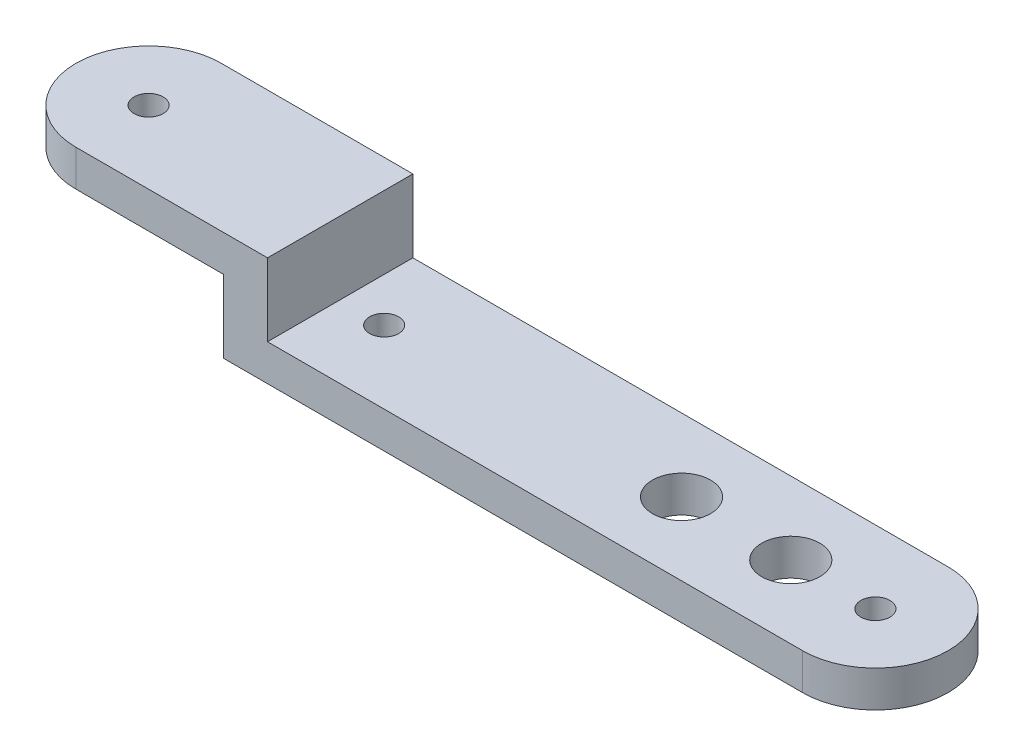
ISO-10303-21;
HEADER;
FILE_DESCRIPTION(('STEP AP214'),'2;1');
FILE_NAME('part.step','',(''),(''),'','','');
FILE_SCHEMA(('AUTOMOTIVE_DESIGN { 1 0 10303 214 1 1 1 1 }'));
ENDSEC;
DATA;
#1=APPLICATION_CONTEXT('core data for automotive mechanical design processes');
#2=APPLICATION_PROTOCOL_DEFINITION('international standard','automotive_design',2000,#1);
#3=PRODUCT_CONTEXT('',#1,'mechanical');
#4=PRODUCT('Part','Part','',(#3));
#5=PRODUCT_RELATED_PRODUCT_CATEGORY('part','',(#4));
#6=PRODUCT_DEFINITION_FORMATION('','',#4);
#7=PRODUCT_DEFINITION_CONTEXT('part definition',#1,'design');
#8=PRODUCT_DEFINITION('design','',#6,#7);
#9=PRODUCT_DEFINITION_SHAPE('','',#8);
#10=(LENGTH_UNIT() NAMED_UNIT(*) SI_UNIT(.MILLI.,.METRE.));
#11=(NAMED_UNIT(*) PLANE_ANGLE_UNIT() SI_UNIT($,.RADIAN.));
#12=(NAMED_UNIT(*) SI_UNIT($,.STERADIAN.) SOLID_ANGLE_UNIT());
#13=UNCERTAINTY_MEASURE_WITH_UNIT(LENGTH_MEASURE(1.E-05),#10,'distance_accuracy_value','');
#14=(GEOMETRIC_REPRESENTATION_CONTEXT(3) GLOBAL_UNCERTAINTY_ASSIGNED_CONTEXT((#13)) GLOBAL_UNIT_ASSIGNED_CONTEXT((#10,
#11,#12)) REPRESENTATION_CONTEXT('',''));
#15=CARTESIAN_POINT('',(0.,0.,0.));
#16=DIRECTION('',(0.,0.,1.));
#17=DIRECTION('',(1.,0.,0.));
#18=AXIS2_PLACEMENT_3D('',#15,#16,#17);
#19=CARTESIAN_POINT('',(0.,15.,0.));
#20=DIRECTION('',(0.,-1.,0.));
#21=DIRECTION('',(0.,0.,-1.));
#22=AXIS2_PLACEMENT_3D('',#19,#20,#21);
#23=CYLINDRICAL_SURFACE('',#22,10.);
#24=CARTESIAN_POINT('',(0.,10.,0.));
#25=DIRECTION('',(0.,-1.,0.));
#26=DIRECTION('',(0.,0.,-1.));
#27=AXIS2_PLACEMENT_3D('',#24,#25,#26);
#28=CIRCLE('',#27,10.);
#29=CARTESIAN_POINT('',(0.,10.,10.));
#30=VERTEX_POINT('',#29);
#31=CARTESIAN_POINT('',(0.,10.,-10.));
#32=VERTEX_POINT('',#31);
#33=EDGE_CURVE('E58',#30,#32,#28,.T.);
#34=ORIENTED_EDGE('',*,*,#33,.F.);
#35=DIRECTION('',(0.,-1.,0.));
#36=VECTOR('',#35,1.);
#37=CARTESIAN_POINT('',(0.,15.,10.));
#38=LINE('',#37,#36);
#39=CARTESIAN_POINT('',(0.,15.,10.));
#40=VERTEX_POINT('',#39);
#41=EDGE_CURVE('E152',#40,#30,#38,.T.);
#42=ORIENTED_EDGE('',*,*,#41,.F.);
#43=CARTESIAN_POINT('',(0.,15.,0.));
#44=DIRECTION('',(0.,1.,0.));
#45=DIRECTION('',(0.,0.,1.));
#46=AXIS2_PLACEMENT_3D('',#43,#44,#45);
#47=CIRCLE('',#46,10.);
#48=CARTESIAN_POINT('',(0.,15.,-10.));
#49=VERTEX_POINT('',#48);
#50=EDGE_CURVE('E130',#49,#40,#47,.T.);
#51=ORIENTED_EDGE('',*,*,#50,.F.);
#52=DIRECTION('',(0.,-1.,0.));
#53=VECTOR('',#52,1.);
#54=CARTESIAN_POINT('',(0.,15.,-10.));
#55=LINE('',#54,#53);
#56=EDGE_CURVE('E141',#49,#32,#55,.T.);
#57=ORIENTED_EDGE('',*,*,#56,.T.);
#58=EDGE_LOOP('',(#34,#42,#51,#57));
#59=FACE_BOUND('',#58,.T.);
#60=ADVANCED_FACE('F43',(#59),#23,.T.);
#61=CARTESIAN_POINT('',(0.,15.,0.));
#62=DIRECTION('',(0.,-1.,0.));
#63=DIRECTION('',(0.,0.,-1.));
#64=AXIS2_PLACEMENT_3D('',#61,#62,#63);
#65=CYLINDRICAL_SURFACE('',#64,2.);
#66=CARTESIAN_POINT('',(0.,15.,0.));
#67=DIRECTION('',(0.,1.,0.));
#68=DIRECTION('',(0.,0.,1.));
#69=AXIS2_PLACEMENT_3D('',#66,#67,#68);
#70=CIRCLE('',#69,2.);
#71=CARTESIAN_POINT('',(0.,15.,2.));
#72=VERTEX_POINT('',#71);
#73=EDGE_CURVE('E229',#72,#72,#70,.T.);
#74=ORIENTED_EDGE('',*,*,#73,.T.);
#75=EDGE_LOOP('',(#74));
#76=FACE_BOUND('',#75,.T.);
#77=CARTESIAN_POINT('',(0.,10.,0.));
#78=DIRECTION('',(0.,-1.,0.));
#79=DIRECTION('',(0.,0.,-1.));
#80=AXIS2_PLACEMENT_3D('',#77,#78,#79);
#81=CIRCLE('',#80,2.);
#82=CARTESIAN_POINT('',(0.,10.,-2.));
#83=VERTEX_POINT('',#82);
#84=EDGE_CURVE('E164',#83,#83,#81,.T.);
#85=ORIENTED_EDGE('',*,*,#84,.T.);
#86=EDGE_LOOP('',(#85));
#87=FACE_BOUND('',#86,.T.);
#88=ADVANCED_FACE('F246',(#76,#87),#65,.F.);
#89=CARTESIAN_POINT('',(100.,15.,0.));
#90=DIRECTION('',(0.,-1.,0.));
#91=DIRECTION('',(0.,0.,-1.));
#92=AXIS2_PLACEMENT_3D('',#89,#90,#91);
#93=CYLINDRICAL_SURFACE('',#92,10.);
#94=CARTESIAN_POINT('',(100.,5.,0.));
#95=DIRECTION('',(0.,1.,0.));
#96=DIRECTION('',(0.,0.,1.));
#97=AXIS2_PLACEMENT_3D('',#94,#95,#96);
#98=CIRCLE('',#97,10.);
#99=CARTESIAN_POINT('',(100.,5.,9.99999999999998));
#100=VERTEX_POINT('',#99);
#101=CARTESIAN_POINT('',(100.,5.,-10.));
#102=VERTEX_POINT('',#101);
#103=EDGE_CURVE('E66',#100,#102,#98,.T.);
#104=ORIENTED_EDGE('',*,*,#103,.F.);
#105=DIRECTION('',(0.,-1.,0.));
#106=VECTOR('',#105,1.);
#107=CARTESIAN_POINT('',(100.,15.,9.99999999999998));
#108=LINE('',#107,#106);
#109=CARTESIAN_POINT('',(100.,0.,9.99999999999998));
#110=VERTEX_POINT('',#109);
#111=EDGE_CURVE('E148',#100,#110,#108,.T.);
#112=ORIENTED_EDGE('',*,*,#111,.T.);
#113=CARTESIAN_POINT('',(100.,0.,0.));
#114=DIRECTION('',(0.,1.,0.));
#115=DIRECTION('',(0.,0.,1.));
#116=AXIS2_PLACEMENT_3D('',#113,#114,#115);
#117=CIRCLE('',#116,10.);
#118=CARTESIAN_POINT('',(100.,0.,-10.));
#119=VERTEX_POINT('',#118);
#120=EDGE_CURVE('E131',#110,#119,#117,.T.);
#121=ORIENTED_EDGE('',*,*,#120,.T.);
#122=DIRECTION('',(0.,-1.,0.));
#123=VECTOR('',#122,1.);
#124=CARTESIAN_POINT('',(100.,15.,-10.));
#125=LINE('',#124,#123);
#126=EDGE_CURVE('E127',#102,#119,#125,.T.);
#127=ORIENTED_EDGE('',*,*,#126,.F.);
#128=EDGE_LOOP('',(#104,#112,#121,#127));
#129=FACE_BOUND('',#128,.T.);
#130=ADVANCED_FACE('F243',(#129),#93,.T.);
#131=CARTESIAN_POINT('',(32.4122445989759,15.,0.));
#132=DIRECTION('',(0.,-1.,0.));
#133=DIRECTION('',(0.,0.,-1.));
#134=AXIS2_PLACEMENT_3D('',#131,#132,#133);
#135=CYLINDRICAL_SURFACE('',#134,2.);
#136=CARTESIAN_POINT('',(32.4122445989759,0.,0.));
#137=DIRECTION('',(0.,1.,0.));
#138=DIRECTION('',(0.,0.,1.));
#139=AXIS2_PLACEMENT_3D('',#136,#137,#138);
#140=CIRCLE('',#139,2.);
#141=CARTESIAN_POINT('',(32.4122445989759,0.,2.));
#142=VERTEX_POINT('',#141);
#143=EDGE_CURVE('E225',#142,#142,#140,.T.);
#144=ORIENTED_EDGE('',*,*,#143,.F.);
#145=EDGE_LOOP('',(#144));
#146=FACE_BOUND('',#145,.T.);
#147=CARTESIAN_POINT('',(32.4122445989759,5.,0.));
#148=DIRECTION('',(0.,1.,0.));
#149=DIRECTION('',(0.,0.,1.));
#150=AXIS2_PLACEMENT_3D('',#147,#148,#149);
#151=CIRCLE('',#150,2.);
#152=CARTESIAN_POINT('',(32.4122445989759,5.,2.));
#153=VERTEX_POINT('',#152);
#154=EDGE_CURVE('E197',#153,#153,#151,.T.);
#155=ORIENTED_EDGE('',*,*,#154,.T.);
#156=EDGE_LOOP('',(#155));
#157=FACE_BOUND('',#156,.T.);
#158=ADVANCED_FACE('F245',(#146,#157),#135,.F.);
#159=CARTESIAN_POINT('',(100.,15.,0.));
#160=DIRECTION('',(0.,-1.,0.));
#161=DIRECTION('',(0.,0.,-1.));
#162=AXIS2_PLACEMENT_3D('',#159,#160,#161);
#163=CYLINDRICAL_SURFACE('',#162,2.);
#164=CARTESIAN_POINT('',(100.,0.,0.));
#165=DIRECTION('',(0.,1.,0.));
#166=DIRECTION('',(0.,0.,1.));
#167=AXIS2_PLACEMENT_3D('',#164,#165,#166);
#168=CIRCLE('',#167,2.);
#169=CARTESIAN_POINT('',(100.,0.,1.99999999999998));
#170=VERTEX_POINT('',#169);
#171=EDGE_CURVE('E221',#170,#170,#168,.T.);
#172=ORIENTED_EDGE('',*,*,#171,.F.);
#173=EDGE_LOOP('',(#172));
#174=FACE_BOUND('',#173,.T.);
#175=CARTESIAN_POINT('',(100.,5.,0.));
#176=DIRECTION('',(0.,1.,0.));
#177=DIRECTION('',(0.,0.,1.));
#178=AXIS2_PLACEMENT_3D('',#175,#176,#177);
#179=CIRCLE('',#178,2.);
#180=CARTESIAN_POINT('',(100.,5.,1.99999999999998));
#181=VERTEX_POINT('',#180);
#182=EDGE_CURVE('E193',#181,#181,#179,.T.);
#183=ORIENTED_EDGE('',*,*,#182,.T.);
#184=EDGE_LOOP('',(#183));
#185=FACE_BOUND('',#184,.T.);
#186=ADVANCED_FACE('F251',(#174,#185),#163,.F.);
#187=CARTESIAN_POINT('',(88.3573592080042,15.,0.));
#188=DIRECTION('',(0.,-1.,0.));
#189=DIRECTION('',(0.,0.,-1.));
#190=AXIS2_PLACEMENT_3D('',#187,#188,#189);
#191=CYLINDRICAL_SURFACE('',#190,4.00000000000001);
#192=CARTESIAN_POINT('',(88.3573592080042,0.,0.));
#193=DIRECTION('',(0.,1.,0.));
#194=DIRECTION('',(0.,0.,1.));
#195=AXIS2_PLACEMENT_3D('',#192,#193,#194);
#196=CIRCLE('',#195,4.00000000000001);
#197=CARTESIAN_POINT('',(88.3573592080042,0.,3.99999999999999));
#198=VERTEX_POINT('',#197);
#199=EDGE_CURVE('E217',#198,#198,#196,.T.);
#200=ORIENTED_EDGE('',*,*,#199,.F.);
#201=EDGE_LOOP('',(#200));
#202=FACE_BOUND('',#201,.T.);
#203=CARTESIAN_POINT('',(88.3573592080042,5.,0.));
#204=DIRECTION('',(0.,1.,0.));
#205=DIRECTION('',(0.,0.,1.));
#206=AXIS2_PLACEMENT_3D('',#203,#204,#205);
#207=CIRCLE('',#206,4.00000000000001);
#208=CARTESIAN_POINT('',(88.3573592080042,5.,3.99999999999999));
#209=VERTEX_POINT('',#208);
#210=EDGE_CURVE('E160',#209,#209,#207,.T.);
#211=ORIENTED_EDGE('',*,*,#210,.T.);
#212=EDGE_LOOP('',(#211));
#213=FACE_BOUND('',#212,.T.);
#214=ADVANCED_FACE('F291',(#202,#213),#191,.F.);
#215=CARTESIAN_POINT('',(73.3214020274519,15.,0.));
#216=DIRECTION('',(0.,-1.,0.));
#217=DIRECTION('',(0.,0.,-1.));
#218=AXIS2_PLACEMENT_3D('',#215,#216,#217);
#219=CYLINDRICAL_SURFACE('',#218,4.00000000000001);
#220=CARTESIAN_POINT('',(73.3214020274519,0.,0.));
#221=DIRECTION('',(0.,1.,0.));
#222=DIRECTION('',(0.,0.,1.));
#223=AXIS2_PLACEMENT_3D('',#220,#221,#222);
#224=CIRCLE('',#223,4.00000000000001);
#225=CARTESIAN_POINT('',(73.3214020274519,0.,3.99999999999999));
#226=VERTEX_POINT('',#225);
#227=EDGE_CURVE('E213',#226,#226,#224,.T.);
#228=ORIENTED_EDGE('',*,*,#227,.F.);
#229=EDGE_LOOP('',(#228));
#230=FACE_BOUND('',#229,.T.);
#231=CARTESIAN_POINT('',(73.3214020274519,5.,0.));
#232=DIRECTION('',(0.,1.,0.));
#233=DIRECTION('',(0.,0.,1.));
#234=AXIS2_PLACEMENT_3D('',#231,#232,#233);
#235=CIRCLE('',#234,4.00000000000001);
#236=CARTESIAN_POINT('',(73.3214020274519,5.,3.99999999999999));
#237=VERTEX_POINT('',#236);
#238=EDGE_CURVE('E156',#237,#237,#235,.T.);
#239=ORIENTED_EDGE('',*,*,#238,.T.);
#240=EDGE_LOOP('',(#239));
#241=FACE_BOUND('',#240,.T.);
#242=ADVANCED_FACE('F288',(#230,#241),#219,.F.);
#243=CARTESIAN_POINT('',(0.,15.,0.));
#244=DIRECTION('',(0.,1.,0.));
#245=DIRECTION('',(0.,0.,1.));
#246=AXIS2_PLACEMENT_3D('',#243,#244,#245);
#247=PLANE('',#246);
#248=DIRECTION('',(0.,0.,1.));
#249=VECTOR('',#248,1.);
#250=CARTESIAN_POINT('',(26.3617481808971,15.,-16.7419544994014));
#251=LINE('',#250,#249);
#252=CARTESIAN_POINT('',(26.3617481808971,15.,-10.));
#253=VERTEX_POINT('',#252);
#254=CARTESIAN_POINT('',(26.3617481808971,15.,10.));
#255=VERTEX_POINT('',#254);
#256=EDGE_CURVE('E184',#253,#255,#251,.T.);
#257=ORIENTED_EDGE('',*,*,#256,.F.);
#258=DIRECTION('',(-1.,0.,0.));
#259=VECTOR('',#258,1.);
#260=CARTESIAN_POINT('',(0.,15.,-10.));
#261=LINE('',#260,#259);
#262=EDGE_CURVE('E145',#253,#49,#261,.T.);
#263=ORIENTED_EDGE('',*,*,#262,.T.);
#264=ORIENTED_EDGE('',*,*,#50,.T.);
#265=DIRECTION('',(1.,0.,0.));
#266=VECTOR('',#265,1.);
#267=CARTESIAN_POINT('',(0.,15.,10.));
#268=LINE('',#267,#266);
#269=EDGE_CURVE('E136',#40,#255,#268,.T.);
#270=ORIENTED_EDGE('',*,*,#269,.T.);
#271=EDGE_LOOP('',(#257,#263,#264,#270));
#272=FACE_BOUND('',#271,.T.);
#273=ORIENTED_EDGE('',*,*,#73,.F.);
#274=EDGE_LOOP('',(#273));
#275=FACE_BOUND('',#274,.T.);
#276=ADVANCED_FACE('F268',(#272,#275),#247,.T.);
#277=CARTESIAN_POINT('',(0.,0.,0.));
#278=DIRECTION('',(0.,1.,0.));
#279=DIRECTION('',(0.,0.,1.));
#280=AXIS2_PLACEMENT_3D('',#277,#278,#279);
#281=PLANE('',#280);
#282=DIRECTION('',(1.,0.,0.));
#283=VECTOR('',#282,1.);
#284=CARTESIAN_POINT('',(0.,0.,10.));
#285=LINE('',#284,#283);
#286=CARTESIAN_POINT('',(20.3022310742114,0.,10.));
#287=VERTEX_POINT('',#286);
#288=EDGE_CURVE('E122',#287,#110,#285,.T.);
#289=ORIENTED_EDGE('',*,*,#288,.F.);
#290=DIRECTION('',(0.,0.,1.));
#291=VECTOR('',#290,1.);
#292=CARTESIAN_POINT('',(20.3022310742114,0.,13.4456111264622));
#293=LINE('',#292,#291);
#294=CARTESIAN_POINT('',(20.3022310742114,0.,-9.99999999999999));
#295=VERTEX_POINT('',#294);
#296=EDGE_CURVE('E109',#295,#287,#293,.T.);
#297=ORIENTED_EDGE('',*,*,#296,.F.);
#298=DIRECTION('',(-1.,0.,0.));
#299=VECTOR('',#298,1.);
#300=CARTESIAN_POINT('',(0.,0.,-10.));
#301=LINE('',#300,#299);
#302=EDGE_CURVE('E121',#119,#295,#301,.T.);
#303=ORIENTED_EDGE('',*,*,#302,.F.);
#304=ORIENTED_EDGE('',*,*,#120,.F.);
#305=EDGE_LOOP('',(#289,#297,#303,#304));
#306=FACE_BOUND('',#305,.T.);
#307=ORIENTED_EDGE('',*,*,#143,.T.);
#308=EDGE_LOOP('',(#307));
#309=FACE_BOUND('',#308,.T.);
#310=ORIENTED_EDGE('',*,*,#171,.T.);
#311=EDGE_LOOP('',(#310));
#312=FACE_BOUND('',#311,.T.);
#313=ORIENTED_EDGE('',*,*,#199,.T.);
#314=EDGE_LOOP('',(#313));
#315=FACE_BOUND('',#314,.T.);
#316=ORIENTED_EDGE('',*,*,#227,.T.);
#317=EDGE_LOOP('',(#316));
#318=FACE_BOUND('',#317,.T.);
#319=ADVANCED_FACE('F118',(#306,#309,#312,#315,#318),#281,.F.);
#320=CARTESIAN_POINT('',(0.,15.,10.));
#321=DIRECTION('',(0.,0.,-1.));
#322=DIRECTION('',(-1.,0.,0.));
#323=AXIS2_PLACEMENT_3D('',#320,#321,#322);
#324=PLANE('',#323);
#325=DIRECTION('',(-1.,0.,0.));
#326=VECTOR('',#325,1.);
#327=CARTESIAN_POINT('',(0.,10.,10.));
#328=LINE('',#327,#326);
#329=CARTESIAN_POINT('',(20.3022310742114,10.,10.));
#330=VERTEX_POINT('',#329);
#331=EDGE_CURVE('E178',#330,#30,#328,.T.);
#332=ORIENTED_EDGE('',*,*,#331,.F.);
#333=DIRECTION('',(0.,-1.,0.));
#334=VECTOR('',#333,1.);
#335=CARTESIAN_POINT('',(20.3022310742114,15.,10.));
#336=LINE('',#335,#334);
#337=EDGE_CURVE('E181',#330,#287,#336,.T.);
#338=ORIENTED_EDGE('',*,*,#337,.T.);
#339=ORIENTED_EDGE('',*,*,#288,.T.);
#340=ORIENTED_EDGE('',*,*,#111,.F.);
#341=DIRECTION('',(1.,0.,0.));
#342=VECTOR('',#341,1.);
#343=CARTESIAN_POINT('',(0.,5.,10.));
#344=LINE('',#343,#342);
#345=CARTESIAN_POINT('',(26.3617481808971,5.,10.));
#346=VERTEX_POINT('',#345);
#347=EDGE_CURVE('E206',#346,#100,#344,.T.);
#348=ORIENTED_EDGE('',*,*,#347,.F.);
#349=DIRECTION('',(0.,1.,0.));
#350=VECTOR('',#349,1.);
#351=CARTESIAN_POINT('',(26.3617481808971,15.,10.));
#352=LINE('',#351,#350);
#353=EDGE_CURVE('E209',#346,#255,#352,.T.);
#354=ORIENTED_EDGE('',*,*,#353,.T.);
#355=ORIENTED_EDGE('',*,*,#269,.F.);
#356=ORIENTED_EDGE('',*,*,#41,.T.);
#357=EDGE_LOOP('',(#332,#338,#339,#340,#348,#354,#355,#356));
#358=FACE_BOUND('',#357,.T.);
#359=ADVANCED_FACE('F240',(#358),#324,.F.);
#360=CARTESIAN_POINT('',(0.,15.,-10.));
#361=DIRECTION('',(0.,0.,1.));
#362=DIRECTION('',(1.,0.,0.));
#363=AXIS2_PLACEMENT_3D('',#360,#361,#362);
#364=PLANE('',#363);
#365=ORIENTED_EDGE('',*,*,#302,.T.);
#366=DIRECTION('',(0.,1.,0.));
#367=VECTOR('',#366,1.);
#368=CARTESIAN_POINT('',(20.3022310742114,15.,-10.));
#369=LINE('',#368,#367);
#370=CARTESIAN_POINT('',(20.3022310742114,10.,-9.99999999999999));
#371=VERTEX_POINT('',#370);
#372=EDGE_CURVE('E11',#295,#371,#369,.T.);
#373=ORIENTED_EDGE('',*,*,#372,.T.);
#374=DIRECTION('',(1.,0.,0.));
#375=VECTOR('',#374,1.);
#376=CARTESIAN_POINT('',(0.,10.,-10.));
#377=LINE('',#376,#375);
#378=EDGE_CURVE('E167',#32,#371,#377,.T.);
#379=ORIENTED_EDGE('',*,*,#378,.F.);
#380=ORIENTED_EDGE('',*,*,#56,.F.);
#381=ORIENTED_EDGE('',*,*,#262,.F.);
#382=DIRECTION('',(0.,-1.,0.));
#383=VECTOR('',#382,1.);
#384=CARTESIAN_POINT('',(26.3617481808971,15.,-10.));
#385=LINE('',#384,#383);
#386=CARTESIAN_POINT('',(26.3617481808971,5.,-10.));
#387=VERTEX_POINT('',#386);
#388=EDGE_CURVE('E51',#253,#387,#385,.T.);
#389=ORIENTED_EDGE('',*,*,#388,.T.);
#390=DIRECTION('',(-1.,0.,0.));
#391=VECTOR('',#390,1.);
#392=CARTESIAN_POINT('',(0.,5.,-10.));
#393=LINE('',#392,#391);
#394=EDGE_CURVE('E201',#102,#387,#393,.T.);
#395=ORIENTED_EDGE('',*,*,#394,.F.);
#396=ORIENTED_EDGE('',*,*,#126,.T.);
#397=EDGE_LOOP('',(#365,#373,#379,#380,#381,#389,#395,#396));
#398=FACE_BOUND('',#397,.T.);
#399=ADVANCED_FACE('F125',(#398),#364,.F.);
#400=CARTESIAN_POINT('',(26.3617481808971,5.,-16.7419544994014));
#401=DIRECTION('',(-1.,0.,0.));
#402=DIRECTION('',(0.,0.,1.));
#403=AXIS2_PLACEMENT_3D('',#400,#401,#402);
#404=PLANE('',#403);
#405=DIRECTION('',(0.,0.,1.));
#406=VECTOR('',#405,1.);
#407=CARTESIAN_POINT('',(26.3617481808971,5.,-16.7419544994014));
#408=LINE('',#407,#406);
#409=EDGE_CURVE('E161',#387,#346,#408,.T.);
#410=ORIENTED_EDGE('',*,*,#409,.F.);
#411=ORIENTED_EDGE('',*,*,#388,.F.);
#412=ORIENTED_EDGE('',*,*,#256,.T.);
#413=ORIENTED_EDGE('',*,*,#353,.F.);
#414=EDGE_LOOP('',(#410,#411,#412,#413));
#415=FACE_BOUND('',#414,.T.);
#416=ADVANCED_FACE('F283',(#415),#404,.F.);
#417=CARTESIAN_POINT('',(0.,5.,0.));
#418=DIRECTION('',(0.,1.,0.));
#419=DIRECTION('',(0.,0.,1.));
#420=AXIS2_PLACEMENT_3D('',#417,#418,#419);
#421=PLANE('',#420);
#422=ORIENTED_EDGE('',*,*,#238,.F.);
#423=EDGE_LOOP('',(#422));
#424=FACE_BOUND('',#423,.T.);
#425=ORIENTED_EDGE('',*,*,#210,.F.);
#426=EDGE_LOOP('',(#425));
#427=FACE_BOUND('',#426,.T.);
#428=ORIENTED_EDGE('',*,*,#182,.F.);
#429=EDGE_LOOP('',(#428));
#430=FACE_BOUND('',#429,.T.);
#431=ORIENTED_EDGE('',*,*,#154,.F.);
#432=EDGE_LOOP('',(#431));
#433=FACE_BOUND('',#432,.T.);
#434=ORIENTED_EDGE('',*,*,#347,.T.);
#435=ORIENTED_EDGE('',*,*,#103,.T.);
#436=ORIENTED_EDGE('',*,*,#394,.T.);
#437=ORIENTED_EDGE('',*,*,#409,.T.);
#438=EDGE_LOOP('',(#434,#435,#436,#437));
#439=FACE_BOUND('',#438,.T.);
#440=ADVANCED_FACE('F278',(#424,#427,#430,#433,#439),#421,.T.);
#441=CARTESIAN_POINT('',(20.3022310742114,10.,13.4456111264622));
#442=DIRECTION('',(1.,0.,0.));
#443=DIRECTION('',(0.,0.,-1.));
#444=AXIS2_PLACEMENT_3D('',#441,#442,#443);
#445=PLANE('',#444);
#446=DIRECTION('',(0.,0.,1.));
#447=VECTOR('',#446,1.);
#448=CARTESIAN_POINT('',(20.3022310742114,10.,13.4456111264622));
#449=LINE('',#448,#447);
#450=EDGE_CURVE('E112',#371,#330,#449,.T.);
#451=ORIENTED_EDGE('',*,*,#450,.F.);
#452=ORIENTED_EDGE('',*,*,#372,.F.);
#453=ORIENTED_EDGE('',*,*,#296,.T.);
#454=ORIENTED_EDGE('',*,*,#337,.F.);
#455=EDGE_LOOP('',(#451,#452,#453,#454));
#456=FACE_BOUND('',#455,.T.);
#457=ADVANCED_FACE('F108',(#456),#445,.F.);
#458=CARTESIAN_POINT('',(0.,10.,0.));
#459=DIRECTION('',(0.,-1.,0.));
#460=DIRECTION('',(0.,0.,-1.));
#461=AXIS2_PLACEMENT_3D('',#458,#459,#460);
#462=PLANE('',#461);
#463=ORIENTED_EDGE('',*,*,#84,.F.);
#464=EDGE_LOOP('',(#463));
#465=FACE_BOUND('',#464,.T.);
#466=ORIENTED_EDGE('',*,*,#331,.T.);
#467=ORIENTED_EDGE('',*,*,#33,.T.);
#468=ORIENTED_EDGE('',*,*,#378,.T.);
#469=ORIENTED_EDGE('',*,*,#450,.T.);
#470=EDGE_LOOP('',(#466,#467,#468,#469));
#471=FACE_BOUND('',#470,.T.);
#472=ADVANCED_FACE('F271',(#465,#471),#462,.T.);
#473=CLOSED_SHELL('',(#60,#88,#130,#158,#186,#214,#242,#276,#319,#359,#399,#416,#440,#457,#472));
#474=MANIFOLD_SOLID_BREP('B2',#473);
#475=ADVANCED_BREP_SHAPE_REPRESENTATION('',(#18,#474),#14);
#476=SHAPE_DEFINITION_REPRESENTATION(#9,#475);
ENDSEC;
END-ISO-10303-21;
